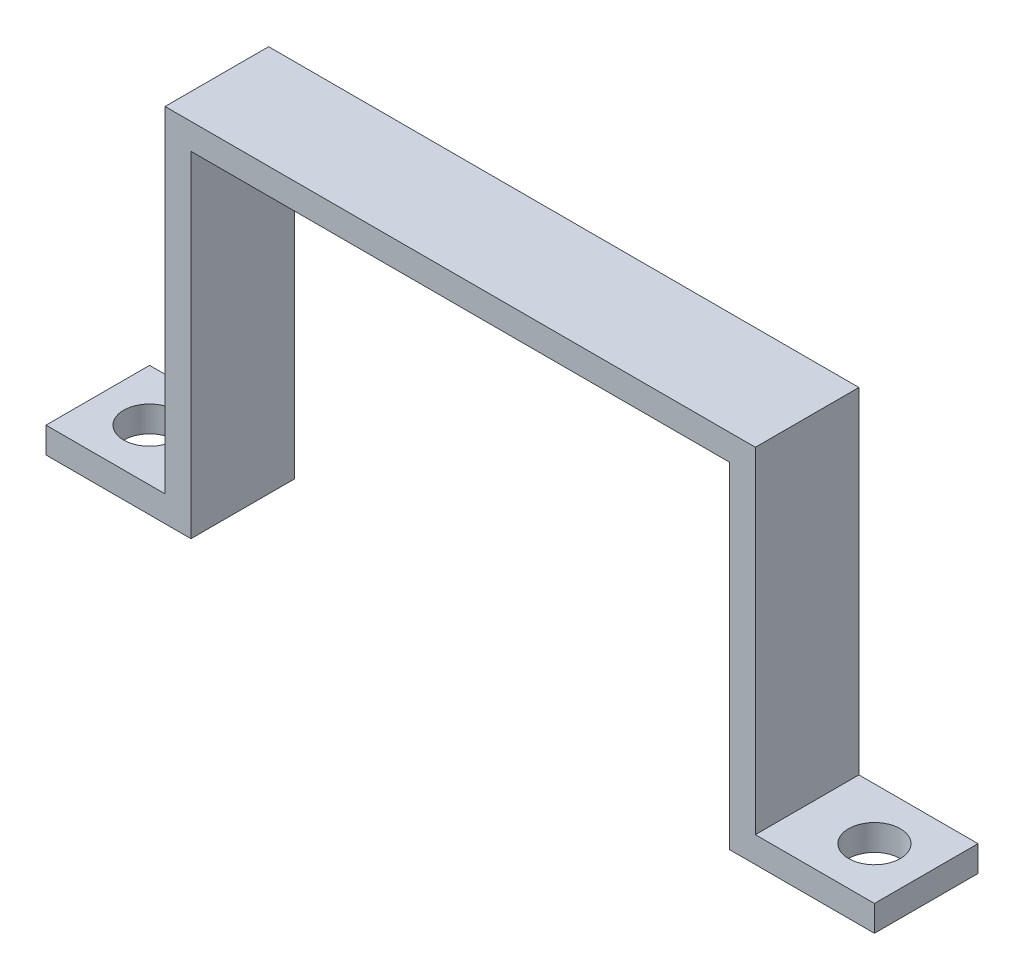
ISO-10303-21;
HEADER;
FILE_DESCRIPTION(('STEP AP214'),'2;1');
FILE_NAME('part.step','',(''),(''),'','','');
FILE_SCHEMA(('AUTOMOTIVE_DESIGN { 1 0 10303 214 1 1 1 1 }'));
ENDSEC;
DATA;
#1=APPLICATION_CONTEXT('core data for automotive mechanical design processes');
#2=APPLICATION_PROTOCOL_DEFINITION('international standard','automotive_design',2000,#1);
#3=PRODUCT_CONTEXT('',#1,'mechanical');
#4=PRODUCT('Part','Part','',(#3));
#5=PRODUCT_RELATED_PRODUCT_CATEGORY('part','',(#4));
#6=PRODUCT_DEFINITION_FORMATION('','',#4);
#7=PRODUCT_DEFINITION_CONTEXT('part definition',#1,'design');
#8=PRODUCT_DEFINITION('design','',#6,#7);
#9=PRODUCT_DEFINITION_SHAPE('','',#8);
#10=(LENGTH_UNIT() NAMED_UNIT(*) SI_UNIT(.MILLI.,.METRE.));
#11=(NAMED_UNIT(*) PLANE_ANGLE_UNIT() SI_UNIT($,.RADIAN.));
#12=(NAMED_UNIT(*) SI_UNIT($,.STERADIAN.) SOLID_ANGLE_UNIT());
#13=UNCERTAINTY_MEASURE_WITH_UNIT(LENGTH_MEASURE(1.E-05),#10,'distance_accuracy_value','');
#14=(GEOMETRIC_REPRESENTATION_CONTEXT(3) GLOBAL_UNCERTAINTY_ASSIGNED_CONTEXT((#13)) GLOBAL_UNIT_ASSIGNED_CONTEXT((#10,
#11,#12)) REPRESENTATION_CONTEXT('',''));
#15=CARTESIAN_POINT('',(0.,0.,0.));
#16=DIRECTION('',(0.,0.,1.));
#17=DIRECTION('',(1.,0.,0.));
#18=AXIS2_PLACEMENT_3D('',#15,#16,#17);
#19=CARTESIAN_POINT('',(-16.51,-18.9865,3.175));
#20=DIRECTION('',(0.,-1.,0.));
#21=DIRECTION('',(0.,0.,-1.));
#22=AXIS2_PLACEMENT_3D('',#19,#20,#21);
#23=PLANE('',#22);
#24=CARTESIAN_POINT('',(-22.225,-18.9865,0.));
#25=DIRECTION('',(0.,-1.,0.));
#26=DIRECTION('',(0.,0.,1.));
#27=AXIS2_PLACEMENT_3D('',#24,#25,#26);
#28=CIRCLE('',#27,1.5875);
#29=CARTESIAN_POINT('',(-22.225,-18.9865,1.5875));
#30=VERTEX_POINT('',#29);
#31=EDGE_CURVE('E267',#30,#30,#28,.T.);
#32=ORIENTED_EDGE('',*,*,#31,.T.);
#33=EDGE_LOOP('',(#32));
#34=FACE_BOUND('',#33,.T.);
#35=DIRECTION('',(1.,0.,0.));
#36=VECTOR('',#35,1.);
#37=CARTESIAN_POINT('',(-16.51,-18.9865,-3.175));
#38=LINE('',#37,#36);
#39=CARTESIAN_POINT('',(-18.0975,-18.9865,-3.175));
#40=VERTEX_POINT('',#39);
#41=CARTESIAN_POINT('',(-25.4,-18.9865,-3.175));
#42=VERTEX_POINT('',#41);
#43=EDGE_CURVE('E154',#40,#42,#38,.F.);
#44=ORIENTED_EDGE('',*,*,#43,.T.);
#45=DIRECTION('',(0.,0.,-1.));
#46=VECTOR('',#45,1.);
#47=CARTESIAN_POINT('',(-25.4,-18.9865,3.175));
#48=LINE('',#47,#46);
#49=CARTESIAN_POINT('',(-25.4,-18.9865,3.175));
#50=VERTEX_POINT('',#49);
#51=EDGE_CURVE('E11',#50,#42,#48,.T.);
#52=ORIENTED_EDGE('',*,*,#51,.F.);
#53=DIRECTION('',(1.,0.,0.));
#54=VECTOR('',#53,1.);
#55=CARTESIAN_POINT('',(-16.51,-18.9865,3.175));
#56=LINE('',#55,#54);
#57=CARTESIAN_POINT('',(-18.0975,-18.9865,3.175));
#58=VERTEX_POINT('',#57);
#59=EDGE_CURVE('E102',#58,#50,#56,.F.);
#60=ORIENTED_EDGE('',*,*,#59,.F.);
#61=DIRECTION('',(0.,0.,-1.));
#62=VECTOR('',#61,1.);
#63=CARTESIAN_POINT('',(-18.0975,-18.9865,3.175));
#64=LINE('',#63,#62);
#65=EDGE_CURVE('E150',#58,#40,#64,.T.);
#66=ORIENTED_EDGE('',*,*,#65,.T.);
#67=EDGE_LOOP('',(#44,#52,#60,#66));
#68=FACE_BOUND('',#67,.T.);
#69=ADVANCED_FACE('F33',(#34,#68),#23,.F.);
#70=CARTESIAN_POINT('',(-25.4,-20.574,3.175));
#71=DIRECTION('',(-1.,0.,0.));
#72=DIRECTION('',(0.,0.,1.));
#73=AXIS2_PLACEMENT_3D('',#70,#71,#72);
#74=PLANE('',#73);
#75=DIRECTION('',(0.,1.,0.));
#76=VECTOR('',#75,1.);
#77=CARTESIAN_POINT('',(-25.4,-20.574,-3.175));
#78=LINE('',#77,#76);
#79=CARTESIAN_POINT('',(-25.4,-20.574,-3.175));
#80=VERTEX_POINT('',#79);
#81=EDGE_CURVE('E157',#80,#42,#78,.T.);
#82=ORIENTED_EDGE('',*,*,#81,.F.);
#83=DIRECTION('',(0.,0.,-1.));
#84=VECTOR('',#83,1.);
#85=CARTESIAN_POINT('',(-25.4,-20.574,3.175));
#86=LINE('',#85,#84);
#87=CARTESIAN_POINT('',(-25.4,-20.574,3.175));
#88=VERTEX_POINT('',#87);
#89=EDGE_CURVE('E42',#88,#80,#86,.T.);
#90=ORIENTED_EDGE('',*,*,#89,.F.);
#91=DIRECTION('',(0.,1.,0.));
#92=VECTOR('',#91,1.);
#93=CARTESIAN_POINT('',(-25.4,-20.574,3.175));
#94=LINE('',#93,#92);
#95=EDGE_CURVE('E221',#88,#50,#94,.T.);
#96=ORIENTED_EDGE('',*,*,#95,.T.);
#97=ORIENTED_EDGE('',*,*,#51,.T.);
#98=EDGE_LOOP('',(#82,#90,#96,#97));
#99=FACE_BOUND('',#98,.T.);
#100=ADVANCED_FACE('F208',(#99),#74,.T.);
#101=CARTESIAN_POINT('',(-16.51,-20.574,3.175));
#102=DIRECTION('',(0.,-1.,0.));
#103=DIRECTION('',(0.,0.,-1.));
#104=AXIS2_PLACEMENT_3D('',#101,#102,#103);
#105=PLANE('',#104);
#106=CARTESIAN_POINT('',(-22.225,-20.574,0.));
#107=DIRECTION('',(0.,-1.,0.));
#108=DIRECTION('',(0.,0.,-1.));
#109=AXIS2_PLACEMENT_3D('',#106,#107,#108);
#110=CIRCLE('',#109,1.5875);
#111=CARTESIAN_POINT('',(-22.225,-20.574,-1.5875));
#112=VERTEX_POINT('',#111);
#113=EDGE_CURVE('E36',#112,#112,#110,.F.);
#114=ORIENTED_EDGE('',*,*,#113,.T.);
#115=EDGE_LOOP('',(#114));
#116=FACE_BOUND('',#115,.T.);
#117=DIRECTION('',(-1.,0.,0.));
#118=VECTOR('',#117,1.);
#119=CARTESIAN_POINT('',(-16.51,-20.574,-3.175));
#120=LINE('',#119,#118);
#121=CARTESIAN_POINT('',(-16.51,-20.574,-3.175));
#122=VERTEX_POINT('',#121);
#123=EDGE_CURVE('E161',#122,#80,#120,.T.);
#124=ORIENTED_EDGE('',*,*,#123,.F.);
#125=DIRECTION('',(0.,0.,-1.));
#126=VECTOR('',#125,1.);
#127=CARTESIAN_POINT('',(-16.51,-20.574,3.175));
#128=LINE('',#127,#126);
#129=CARTESIAN_POINT('',(-16.51,-20.574,3.175));
#130=VERTEX_POINT('',#129);
#131=EDGE_CURVE('E197',#130,#122,#128,.T.);
#132=ORIENTED_EDGE('',*,*,#131,.F.);
#133=DIRECTION('',(-1.,0.,0.));
#134=VECTOR('',#133,1.);
#135=CARTESIAN_POINT('',(-16.51,-20.574,3.175));
#136=LINE('',#135,#134);
#137=EDGE_CURVE('E205',#130,#88,#136,.T.);
#138=ORIENTED_EDGE('',*,*,#137,.T.);
#139=ORIENTED_EDGE('',*,*,#89,.T.);
#140=EDGE_LOOP('',(#124,#132,#138,#139));
#141=FACE_BOUND('',#140,.T.);
#142=ADVANCED_FACE('F203',(#116,#141),#105,.T.);
#143=CARTESIAN_POINT('',(-16.51,0.,3.175));
#144=DIRECTION('',(1.,0.,0.));
#145=DIRECTION('',(0.,0.,-1.));
#146=AXIS2_PLACEMENT_3D('',#143,#144,#145);
#147=PLANE('',#146);
#148=DIRECTION('',(0.,-1.,0.));
#149=VECTOR('',#148,1.);
#150=CARTESIAN_POINT('',(-16.51,0.,-3.175));
#151=LINE('',#150,#149);
#152=CARTESIAN_POINT('',(-16.51,0.,-3.175));
#153=VERTEX_POINT('',#152);
#154=EDGE_CURVE('E164',#153,#122,#151,.T.);
#155=ORIENTED_EDGE('',*,*,#154,.F.);
#156=DIRECTION('',(0.,0.,-1.));
#157=VECTOR('',#156,1.);
#158=CARTESIAN_POINT('',(-16.51,0.,3.175));
#159=LINE('',#158,#157);
#160=CARTESIAN_POINT('',(-16.51,0.,3.175));
#161=VERTEX_POINT('',#160);
#162=EDGE_CURVE('E195',#161,#153,#159,.T.);
#163=ORIENTED_EDGE('',*,*,#162,.F.);
#164=DIRECTION('',(0.,-1.,0.));
#165=VECTOR('',#164,1.);
#166=CARTESIAN_POINT('',(-16.51,0.,3.175));
#167=LINE('',#166,#165);
#168=EDGE_CURVE('E218',#161,#130,#167,.T.);
#169=ORIENTED_EDGE('',*,*,#168,.T.);
#170=ORIENTED_EDGE('',*,*,#131,.T.);
#171=EDGE_LOOP('',(#155,#163,#169,#170));
#172=FACE_BOUND('',#171,.T.);
#173=ADVANCED_FACE('F215',(#172),#147,.T.);
#174=CARTESIAN_POINT('',(-16.51,0.,3.175));
#175=DIRECTION('',(0.,-1.,0.));
#176=DIRECTION('',(0.,0.,-1.));
#177=AXIS2_PLACEMENT_3D('',#174,#175,#176);
#178=PLANE('',#177);
#179=DIRECTION('',(-1.,0.,0.));
#180=VECTOR('',#179,1.);
#181=CARTESIAN_POINT('',(-16.51,0.,-3.175));
#182=LINE('',#181,#180);
#183=CARTESIAN_POINT('',(16.51,0.,-3.175));
#184=VERTEX_POINT('',#183);
#185=EDGE_CURVE('E167',#184,#153,#182,.T.);
#186=ORIENTED_EDGE('',*,*,#185,.F.);
#187=DIRECTION('',(0.,0.,-1.));
#188=VECTOR('',#187,1.);
#189=CARTESIAN_POINT('',(16.51,0.,3.175));
#190=LINE('',#189,#188);
#191=CARTESIAN_POINT('',(16.51,0.,3.175));
#192=VERTEX_POINT('',#191);
#193=EDGE_CURVE('E193',#192,#184,#190,.T.);
#194=ORIENTED_EDGE('',*,*,#193,.F.);
#195=DIRECTION('',(-1.,0.,0.));
#196=VECTOR('',#195,1.);
#197=CARTESIAN_POINT('',(-16.51,0.,3.175));
#198=LINE('',#197,#196);
#199=EDGE_CURVE('E223',#192,#161,#198,.T.);
#200=ORIENTED_EDGE('',*,*,#199,.T.);
#201=ORIENTED_EDGE('',*,*,#162,.T.);
#202=EDGE_LOOP('',(#186,#194,#200,#201));
#203=FACE_BOUND('',#202,.T.);
#204=ADVANCED_FACE('F307',(#203),#178,.T.);
#205=CARTESIAN_POINT('',(16.51,0.,3.175));
#206=DIRECTION('',(-1.,0.,0.));
#207=DIRECTION('',(0.,0.,1.));
#208=AXIS2_PLACEMENT_3D('',#205,#206,#207);
#209=PLANE('',#208);
#210=DIRECTION('',(0.,1.,0.));
#211=VECTOR('',#210,1.);
#212=CARTESIAN_POINT('',(16.51,0.,-3.175));
#213=LINE('',#212,#211);
#214=CARTESIAN_POINT('',(16.51,-20.574,-3.175));
#215=VERTEX_POINT('',#214);
#216=EDGE_CURVE('E170',#215,#184,#213,.T.);
#217=ORIENTED_EDGE('',*,*,#216,.F.);
#218=DIRECTION('',(0.,0.,-1.));
#219=VECTOR('',#218,1.);
#220=CARTESIAN_POINT('',(16.51,-20.574,3.175));
#221=LINE('',#220,#219);
#222=CARTESIAN_POINT('',(16.51,-20.574,3.175));
#223=VERTEX_POINT('',#222);
#224=EDGE_CURVE('E191',#223,#215,#221,.T.);
#225=ORIENTED_EDGE('',*,*,#224,.F.);
#226=DIRECTION('',(0.,1.,0.));
#227=VECTOR('',#226,1.);
#228=CARTESIAN_POINT('',(16.51,0.,3.175));
#229=LINE('',#228,#227);
#230=EDGE_CURVE('E229',#223,#192,#229,.T.);
#231=ORIENTED_EDGE('',*,*,#230,.T.);
#232=ORIENTED_EDGE('',*,*,#193,.T.);
#233=EDGE_LOOP('',(#217,#225,#231,#232));
#234=FACE_BOUND('',#233,.T.);
#235=ADVANCED_FACE('F302',(#234),#209,.T.);
#236=CARTESIAN_POINT('',(16.51,-20.574,3.175));
#237=DIRECTION('',(0.,-1.,0.));
#238=DIRECTION('',(0.,0.,-1.));
#239=AXIS2_PLACEMENT_3D('',#236,#237,#238);
#240=PLANE('',#239);
#241=CARTESIAN_POINT('',(22.225,-20.574,0.));
#242=DIRECTION('',(0.,-1.,0.));
#243=DIRECTION('',(0.,0.,-1.));
#244=AXIS2_PLACEMENT_3D('',#241,#242,#243);
#245=CIRCLE('',#244,1.5875);
#246=CARTESIAN_POINT('',(22.225,-20.574,-1.5875));
#247=VERTEX_POINT('',#246);
#248=EDGE_CURVE('E158',#247,#247,#245,.T.);
#249=ORIENTED_EDGE('',*,*,#248,.F.);
#250=EDGE_LOOP('',(#249));
#251=FACE_BOUND('',#250,.T.);
#252=DIRECTION('',(-1.,0.,0.));
#253=VECTOR('',#252,1.);
#254=CARTESIAN_POINT('',(16.51,-20.574,-3.175));
#255=LINE('',#254,#253);
#256=CARTESIAN_POINT('',(25.4,-20.574,-3.175));
#257=VERTEX_POINT('',#256);
#258=EDGE_CURVE('E173',#257,#215,#255,.T.);
#259=ORIENTED_EDGE('',*,*,#258,.F.);
#260=DIRECTION('',(0.,0.,-1.));
#261=VECTOR('',#260,1.);
#262=CARTESIAN_POINT('',(25.4,-20.574,3.175));
#263=LINE('',#262,#261);
#264=CARTESIAN_POINT('',(25.4,-20.574,3.175));
#265=VERTEX_POINT('',#264);
#266=EDGE_CURVE('E189',#265,#257,#263,.T.);
#267=ORIENTED_EDGE('',*,*,#266,.F.);
#268=DIRECTION('',(-1.,0.,0.));
#269=VECTOR('',#268,1.);
#270=CARTESIAN_POINT('',(16.51,-20.574,3.175));
#271=LINE('',#270,#269);
#272=EDGE_CURVE('E232',#265,#223,#271,.T.);
#273=ORIENTED_EDGE('',*,*,#272,.T.);
#274=ORIENTED_EDGE('',*,*,#224,.T.);
#275=EDGE_LOOP('',(#259,#267,#273,#274));
#276=FACE_BOUND('',#275,.T.);
#277=ADVANCED_FACE('F244',(#251,#276),#240,.T.);
#278=CARTESIAN_POINT('',(25.4,-18.9865,3.175));
#279=DIRECTION('',(1.,0.,0.));
#280=DIRECTION('',(0.,0.,-1.));
#281=AXIS2_PLACEMENT_3D('',#278,#279,#280);
#282=PLANE('',#281);
#283=DIRECTION('',(0.,-1.,0.));
#284=VECTOR('',#283,1.);
#285=CARTESIAN_POINT('',(25.4,-18.9865,-3.175));
#286=LINE('',#285,#284);
#287=CARTESIAN_POINT('',(25.4,-18.9865,-3.175));
#288=VERTEX_POINT('',#287);
#289=EDGE_CURVE('E176',#288,#257,#286,.T.);
#290=ORIENTED_EDGE('',*,*,#289,.F.);
#291=DIRECTION('',(0.,0.,-1.));
#292=VECTOR('',#291,1.);
#293=CARTESIAN_POINT('',(25.4,-18.9865,3.175));
#294=LINE('',#293,#292);
#295=CARTESIAN_POINT('',(25.4,-18.9865,3.175));
#296=VERTEX_POINT('',#295);
#297=EDGE_CURVE('E187',#296,#288,#294,.T.);
#298=ORIENTED_EDGE('',*,*,#297,.F.);
#299=DIRECTION('',(0.,-1.,0.));
#300=VECTOR('',#299,1.);
#301=CARTESIAN_POINT('',(25.4,-18.9865,3.175));
#302=LINE('',#301,#300);
#303=EDGE_CURVE('E235',#296,#265,#302,.T.);
#304=ORIENTED_EDGE('',*,*,#303,.T.);
#305=ORIENTED_EDGE('',*,*,#266,.T.);
#306=EDGE_LOOP('',(#290,#298,#304,#305));
#307=FACE_BOUND('',#306,.T.);
#308=ADVANCED_FACE('F239',(#307),#282,.T.);
#309=CARTESIAN_POINT('',(16.51,-18.9865,3.175));
#310=DIRECTION('',(0.,-1.,0.));
#311=DIRECTION('',(0.,0.,-1.));
#312=AXIS2_PLACEMENT_3D('',#309,#310,#311);
#313=PLANE('',#312);
#314=CARTESIAN_POINT('',(22.225,-18.9865,0.));
#315=DIRECTION('',(0.,1.,0.));
#316=DIRECTION('',(0.,0.,1.));
#317=AXIS2_PLACEMENT_3D('',#314,#315,#316);
#318=CIRCLE('',#317,1.5875);
#319=CARTESIAN_POINT('',(22.225,-18.9865,1.5875));
#320=VERTEX_POINT('',#319);
#321=EDGE_CURVE('E293',#320,#320,#318,.T.);
#322=ORIENTED_EDGE('',*,*,#321,.F.);
#323=EDGE_LOOP('',(#322));
#324=FACE_BOUND('',#323,.T.);
#325=DIRECTION('',(1.,0.,0.));
#326=VECTOR('',#325,1.);
#327=CARTESIAN_POINT('',(16.51,-18.9865,-3.175));
#328=LINE('',#327,#326);
#329=CARTESIAN_POINT('',(18.0975,-18.9865,-3.175));
#330=VERTEX_POINT('',#329);
#331=EDGE_CURVE('E179',#288,#330,#328,.F.);
#332=ORIENTED_EDGE('',*,*,#331,.T.);
#333=DIRECTION('',(0.,0.,-1.));
#334=VECTOR('',#333,1.);
#335=CARTESIAN_POINT('',(18.0975,-18.9865,3.175));
#336=LINE('',#335,#334);
#337=CARTESIAN_POINT('',(18.0975,-18.9865,3.175));
#338=VERTEX_POINT('',#337);
#339=EDGE_CURVE('E145',#338,#330,#336,.T.);
#340=ORIENTED_EDGE('',*,*,#339,.F.);
#341=DIRECTION('',(1.,0.,0.));
#342=VECTOR('',#341,1.);
#343=CARTESIAN_POINT('',(16.51,-18.9865,3.175));
#344=LINE('',#343,#342);
#345=EDGE_CURVE('E136',#296,#338,#344,.F.);
#346=ORIENTED_EDGE('',*,*,#345,.F.);
#347=ORIENTED_EDGE('',*,*,#297,.T.);
#348=EDGE_LOOP('',(#332,#340,#346,#347));
#349=FACE_BOUND('',#348,.T.);
#350=ADVANCED_FACE('F248',(#324,#349),#313,.F.);
#351=CARTESIAN_POINT('',(18.0975,0.,3.175));
#352=DIRECTION('',(-1.,0.,0.));
#353=DIRECTION('',(0.,0.,1.));
#354=AXIS2_PLACEMENT_3D('',#351,#352,#353);
#355=PLANE('',#354);
#356=DIRECTION('',(0.,1.,0.));
#357=VECTOR('',#356,1.);
#358=CARTESIAN_POINT('',(18.0975,0.,-3.175));
#359=LINE('',#358,#357);
#360=CARTESIAN_POINT('',(18.0975,1.5875,-3.175));
#361=VERTEX_POINT('',#360);
#362=EDGE_CURVE('E144',#330,#361,#359,.T.);
#363=ORIENTED_EDGE('',*,*,#362,.T.);
#364=DIRECTION('',(0.,0.,-1.));
#365=VECTOR('',#364,1.);
#366=CARTESIAN_POINT('',(18.0975,1.5875,3.175));
#367=LINE('',#366,#365);
#368=CARTESIAN_POINT('',(18.0975,1.5875,3.175));
#369=VERTEX_POINT('',#368);
#370=EDGE_CURVE('E141',#369,#361,#367,.T.);
#371=ORIENTED_EDGE('',*,*,#370,.F.);
#372=DIRECTION('',(0.,1.,0.));
#373=VECTOR('',#372,1.);
#374=CARTESIAN_POINT('',(18.0975,0.,3.175));
#375=LINE('',#374,#373);
#376=EDGE_CURVE('E129',#338,#369,#375,.T.);
#377=ORIENTED_EDGE('',*,*,#376,.F.);
#378=ORIENTED_EDGE('',*,*,#339,.T.);
#379=EDGE_LOOP('',(#363,#371,#377,#378));
#380=FACE_BOUND('',#379,.T.);
#381=ADVANCED_FACE('F142',(#380),#355,.F.);
#382=CARTESIAN_POINT('',(-16.51,1.5875,3.175));
#383=DIRECTION('',(0.,-1.,0.));
#384=DIRECTION('',(0.,0.,-1.));
#385=AXIS2_PLACEMENT_3D('',#382,#383,#384);
#386=PLANE('',#385);
#387=DIRECTION('',(1.,0.,0.));
#388=VECTOR('',#387,1.);
#389=CARTESIAN_POINT('',(-16.51,1.5875,-3.175));
#390=LINE('',#389,#388);
#391=CARTESIAN_POINT('',(-18.0975,1.5875,-3.175));
#392=VERTEX_POINT('',#391);
#393=EDGE_CURVE('E90',#361,#392,#390,.F.);
#394=ORIENTED_EDGE('',*,*,#393,.T.);
#395=DIRECTION('',(0.,0.,-1.));
#396=VECTOR('',#395,1.);
#397=CARTESIAN_POINT('',(-18.0975,1.5875,3.175));
#398=LINE('',#397,#396);
#399=CARTESIAN_POINT('',(-18.0975,1.5875,3.175));
#400=VERTEX_POINT('',#399);
#401=EDGE_CURVE('E146',#400,#392,#398,.T.);
#402=ORIENTED_EDGE('',*,*,#401,.F.);
#403=DIRECTION('',(1.,0.,0.));
#404=VECTOR('',#403,1.);
#405=CARTESIAN_POINT('',(-16.51,1.5875,3.175));
#406=LINE('',#405,#404);
#407=EDGE_CURVE('E133',#369,#400,#406,.F.);
#408=ORIENTED_EDGE('',*,*,#407,.F.);
#409=ORIENTED_EDGE('',*,*,#370,.T.);
#410=EDGE_LOOP('',(#394,#402,#408,#409));
#411=FACE_BOUND('',#410,.T.);
#412=ADVANCED_FACE('F148',(#411),#386,.F.);
#413=CARTESIAN_POINT('',(-18.0975,0.,3.175));
#414=DIRECTION('',(1.,0.,0.));
#415=DIRECTION('',(0.,0.,-1.));
#416=AXIS2_PLACEMENT_3D('',#413,#414,#415);
#417=PLANE('',#416);
#418=DIRECTION('',(0.,1.,0.));
#419=VECTOR('',#418,1.);
#420=CARTESIAN_POINT('',(-18.0975,0.,-3.175));
#421=LINE('',#420,#419);
#422=EDGE_CURVE('E96',#392,#40,#421,.F.);
#423=ORIENTED_EDGE('',*,*,#422,.T.);
#424=ORIENTED_EDGE('',*,*,#65,.F.);
#425=DIRECTION('',(0.,1.,0.));
#426=VECTOR('',#425,1.);
#427=CARTESIAN_POINT('',(-18.0975,0.,3.175));
#428=LINE('',#427,#426);
#429=EDGE_CURVE('E50',#400,#58,#428,.F.);
#430=ORIENTED_EDGE('',*,*,#429,.F.);
#431=ORIENTED_EDGE('',*,*,#401,.T.);
#432=EDGE_LOOP('',(#423,#424,#430,#431));
#433=FACE_BOUND('',#432,.T.);
#434=ADVANCED_FACE('F268',(#433),#417,.F.);
#435=CARTESIAN_POINT('',(0.,0.,3.175));
#436=DIRECTION('',(0.,0.,1.));
#437=DIRECTION('',(1.,0.,0.));
#438=AXIS2_PLACEMENT_3D('',#435,#436,#437);
#439=PLANE('',#438);
#440=ORIENTED_EDGE('',*,*,#59,.T.);
#441=ORIENTED_EDGE('',*,*,#95,.F.);
#442=ORIENTED_EDGE('',*,*,#137,.F.);
#443=ORIENTED_EDGE('',*,*,#168,.F.);
#444=ORIENTED_EDGE('',*,*,#199,.F.);
#445=ORIENTED_EDGE('',*,*,#230,.F.);
#446=ORIENTED_EDGE('',*,*,#272,.F.);
#447=ORIENTED_EDGE('',*,*,#303,.F.);
#448=ORIENTED_EDGE('',*,*,#345,.T.);
#449=ORIENTED_EDGE('',*,*,#376,.T.);
#450=ORIENTED_EDGE('',*,*,#407,.T.);
#451=ORIENTED_EDGE('',*,*,#429,.T.);
#452=EDGE_LOOP('',(#440,#441,#442,#443,#444,#445,#446,#447,#448,#449,#450,#451));
#453=FACE_BOUND('',#452,.T.);
#454=ADVANCED_FACE('F131',(#453),#439,.T.);
#455=CARTESIAN_POINT('',(0.,0.,-3.175));
#456=DIRECTION('',(0.,0.,1.));
#457=DIRECTION('',(1.,0.,0.));
#458=AXIS2_PLACEMENT_3D('',#455,#456,#457);
#459=PLANE('',#458);
#460=ORIENTED_EDGE('',*,*,#43,.F.);
#461=ORIENTED_EDGE('',*,*,#422,.F.);
#462=ORIENTED_EDGE('',*,*,#393,.F.);
#463=ORIENTED_EDGE('',*,*,#362,.F.);
#464=ORIENTED_EDGE('',*,*,#331,.F.);
#465=ORIENTED_EDGE('',*,*,#289,.T.);
#466=ORIENTED_EDGE('',*,*,#258,.T.);
#467=ORIENTED_EDGE('',*,*,#216,.T.);
#468=ORIENTED_EDGE('',*,*,#185,.T.);
#469=ORIENTED_EDGE('',*,*,#154,.T.);
#470=ORIENTED_EDGE('',*,*,#123,.T.);
#471=ORIENTED_EDGE('',*,*,#81,.T.);
#472=EDGE_LOOP('',(#460,#461,#462,#463,#464,#465,#466,#467,#468,#469,#470,#471));
#473=FACE_BOUND('',#472,.T.);
#474=ADVANCED_FACE('F211',(#473),#459,.F.);
#475=CARTESIAN_POINT('',(22.225,-21.5265,0.));
#476=DIRECTION('',(0.,1.,0.));
#477=DIRECTION('',(0.,0.,1.));
#478=AXIS2_PLACEMENT_3D('',#475,#476,#477);
#479=CYLINDRICAL_SURFACE('',#478,1.5875);
#480=ORIENTED_EDGE('',*,*,#248,.T.);
#481=EDGE_LOOP('',(#480));
#482=FACE_BOUND('',#481,.T.);
#483=ORIENTED_EDGE('',*,*,#321,.T.);
#484=EDGE_LOOP('',(#483));
#485=FACE_BOUND('',#484,.T.);
#486=ADVANCED_FACE('F279',(#482,#485),#479,.F.);
#487=CARTESIAN_POINT('',(-22.225,-21.5265,0.));
#488=DIRECTION('',(0.,1.,0.));
#489=DIRECTION('',(0.,0.,1.));
#490=AXIS2_PLACEMENT_3D('',#487,#488,#489);
#491=CYLINDRICAL_SURFACE('',#490,1.5875);
#492=ORIENTED_EDGE('',*,*,#113,.F.);
#493=EDGE_LOOP('',(#492));
#494=FACE_BOUND('',#493,.T.);
#495=ORIENTED_EDGE('',*,*,#31,.F.);
#496=EDGE_LOOP('',(#495));
#497=FACE_BOUND('',#496,.T.);
#498=ADVANCED_FACE('F283',(#494,#497),#491,.F.);
#499=CLOSED_SHELL('',(#69,#100,#142,#173,#204,#235,#277,#308,#350,#381,#412,#434,#454,#474,#486,#498));
#500=MANIFOLD_SOLID_BREP('B2',#499);
#501=ADVANCED_BREP_SHAPE_REPRESENTATION('',(#18,#500),#14);
#502=SHAPE_DEFINITION_REPRESENTATION(#9,#501);
ENDSEC;
END-ISO-10303-21;
